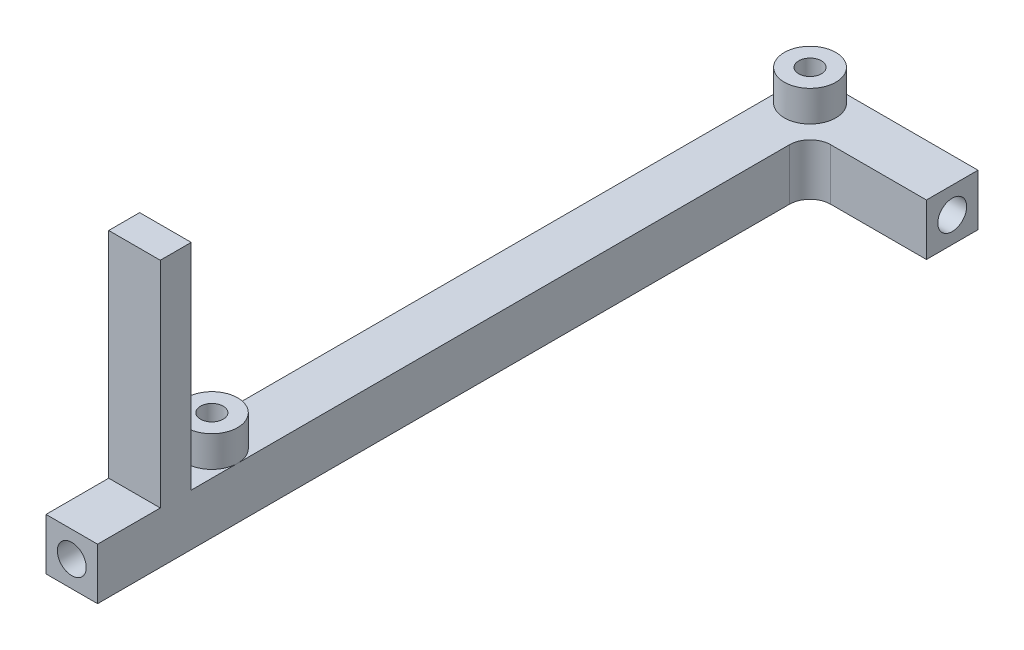
ISO-10303-21;
HEADER;
FILE_DESCRIPTION(('STEP AP214'),'2;1');
FILE_NAME('part.step','',(''),(''),'','','');
FILE_SCHEMA(('AUTOMOTIVE_DESIGN { 1 0 10303 214 1 1 1 1 }'));
ENDSEC;
DATA;
#1=APPLICATION_CONTEXT('core data for automotive mechanical design processes');
#2=APPLICATION_PROTOCOL_DEFINITION('international standard','automotive_design',2000,#1);
#3=PRODUCT_CONTEXT('',#1,'mechanical');
#4=PRODUCT('Part','Part','',(#3));
#5=PRODUCT_RELATED_PRODUCT_CATEGORY('part','',(#4));
#6=PRODUCT_DEFINITION_FORMATION('','',#4);
#7=PRODUCT_DEFINITION_CONTEXT('part definition',#1,'design');
#8=PRODUCT_DEFINITION('design','',#6,#7);
#9=PRODUCT_DEFINITION_SHAPE('','',#8);
#10=(LENGTH_UNIT() NAMED_UNIT(*) SI_UNIT(.MILLI.,.METRE.));
#11=(NAMED_UNIT(*) PLANE_ANGLE_UNIT() SI_UNIT($,.RADIAN.));
#12=(NAMED_UNIT(*) SI_UNIT($,.STERADIAN.) SOLID_ANGLE_UNIT());
#13=UNCERTAINTY_MEASURE_WITH_UNIT(LENGTH_MEASURE(1.E-05),#10,'distance_accuracy_value','');
#14=(GEOMETRIC_REPRESENTATION_CONTEXT(3) GLOBAL_UNCERTAINTY_ASSIGNED_CONTEXT((#13)) GLOBAL_UNIT_ASSIGNED_CONTEXT((#10,
#11,#12)) REPRESENTATION_CONTEXT('',''));
#15=CARTESIAN_POINT('',(0.,0.,0.));
#16=DIRECTION('',(0.,0.,1.));
#17=DIRECTION('',(1.,0.,0.));
#18=AXIS2_PLACEMENT_3D('',#15,#16,#17);
#19=CARTESIAN_POINT('',(-2.5,2.5,74.08));
#20=DIRECTION('',(0.,-1.,0.));
#21=DIRECTION('',(0.,0.,-1.));
#22=AXIS2_PLACEMENT_3D('',#19,#20,#21);
#23=PLANE('',#22);
#24=DIRECTION('',(1.,0.,0.));
#25=VECTOR('',#24,1.);
#26=CARTESIAN_POINT('',(-2.5,2.5,68.));
#27=LINE('',#26,#25);
#28=CARTESIAN_POINT('',(-2.5,2.5,68.));
#29=VERTEX_POINT('',#28);
#30=CARTESIAN_POINT('',(2.5,2.5,68.));
#31=VERTEX_POINT('',#30);
#32=EDGE_CURVE('E367',#29,#31,#27,.T.);
#33=ORIENTED_EDGE('',*,*,#32,.F.);
#34=DIRECTION('',(0.,0.,-1.));
#35=VECTOR('',#34,1.);
#36=CARTESIAN_POINT('',(-2.5,2.5,74.08));
#37=LINE('',#36,#35);
#38=CARTESIAN_POINT('',(-2.5,2.5,74.08));
#39=VERTEX_POINT('',#38);
#40=EDGE_CURVE('E167',#39,#29,#37,.T.);
#41=ORIENTED_EDGE('',*,*,#40,.F.);
#42=DIRECTION('',(-1.,0.,0.));
#43=VECTOR('',#42,1.);
#44=CARTESIAN_POINT('',(-2.5,2.5,74.08));
#45=LINE('',#44,#43);
#46=CARTESIAN_POINT('',(2.5,2.5,74.08));
#47=VERTEX_POINT('',#46);
#48=EDGE_CURVE('E252',#47,#39,#45,.T.);
#49=ORIENTED_EDGE('',*,*,#48,.F.);
#50=DIRECTION('',(0.,0.,-1.));
#51=VECTOR('',#50,1.);
#52=CARTESIAN_POINT('',(2.5,2.5,74.08));
#53=LINE('',#52,#51);
#54=EDGE_CURVE('E280',#47,#31,#53,.T.);
#55=ORIENTED_EDGE('',*,*,#54,.T.);
#56=EDGE_LOOP('',(#33,#41,#49,#55));
#57=FACE_BOUND('',#56,.T.);
#58=ADVANCED_FACE('F39',(#57),#23,.F.);
#59=DIRECTION('',(-1.,0.,0.));
#60=VECTOR('',#59,1.);
#61=CARTESIAN_POINT('',(-2.5,2.5,65.));
#62=LINE('',#61,#60);
#63=CARTESIAN_POINT('',(2.5,2.5,65.));
#64=VERTEX_POINT('',#63);
#65=CARTESIAN_POINT('',(-2.5,2.5,65.));
#66=VERTEX_POINT('',#65);
#67=EDGE_CURVE('E160',#64,#66,#62,.T.);
#68=ORIENTED_EDGE('',*,*,#67,.F.);
#69=CARTESIAN_POINT('',(2.5,2.5,60.5));
#70=VERTEX_POINT('',#69);
#71=EDGE_CURVE('E284',#64,#70,#53,.T.);
#72=ORIENTED_EDGE('',*,*,#71,.T.);
#73=CARTESIAN_POINT('',(0.,2.5,60.5));
#74=DIRECTION('',(0.,1.,0.));
#75=DIRECTION('',(0.,0.,1.));
#76=AXIS2_PLACEMENT_3D('',#73,#74,#75);
#77=CIRCLE('',#76,2.49999999999999);
#78=CARTESIAN_POINT('',(-2.5,2.5,60.5));
#79=VERTEX_POINT('',#78);
#80=EDGE_CURVE('E209',#79,#70,#77,.T.);
#81=ORIENTED_EDGE('',*,*,#80,.F.);
#82=EDGE_CURVE('E278',#66,#79,#37,.T.);
#83=ORIENTED_EDGE('',*,*,#82,.F.);
#84=EDGE_LOOP('',(#68,#72,#81,#83));
#85=FACE_BOUND('',#84,.T.);
#86=ADVANCED_FACE('F358',(#85),#23,.F.);
#87=DIRECTION('',(-1.,0.,0.));
#88=VECTOR('',#87,1.);
#89=CARTESIAN_POINT('',(-2.5,2.5,0.));
#90=LINE('',#89,#88);
#91=CARTESIAN_POINT('',(0.,2.5,0.));
#92=VERTEX_POINT('',#91);
#93=CARTESIAN_POINT('',(-0.500000000000001,2.5,0.));
#94=VERTEX_POINT('',#93);
#95=EDGE_CURVE('E244',#92,#94,#90,.T.);
#96=ORIENTED_EDGE('',*,*,#95,.T.);
#97=CARTESIAN_POINT('',(-0.500000000000001,2.5,2.));
#98=DIRECTION('',(0.,-1.,0.));
#99=DIRECTION('',(0.,0.,-1.));
#100=AXIS2_PLACEMENT_3D('',#97,#98,#99);
#101=CIRCLE('',#100,2.);
#102=CARTESIAN_POINT('',(-2.5,2.5,2.00000000000003));
#103=VERTEX_POINT('',#102);
#104=EDGE_CURVE('E295',#94,#103,#101,.F.);
#105=ORIENTED_EDGE('',*,*,#104,.T.);
#106=CARTESIAN_POINT('',(-2.5,2.5,2.50000000000004));
#107=VERTEX_POINT('',#106);
#108=EDGE_CURVE('E274',#107,#103,#37,.T.);
#109=ORIENTED_EDGE('',*,*,#108,.F.);
#110=CARTESIAN_POINT('',(0.,2.5,2.50000000000002));
#111=DIRECTION('',(0.,1.,0.));
#112=DIRECTION('',(0.,0.,1.));
#113=AXIS2_PLACEMENT_3D('',#110,#111,#112);
#114=CIRCLE('',#113,2.5);
#115=EDGE_CURVE('E189',#92,#107,#114,.T.);
#116=ORIENTED_EDGE('',*,*,#115,.F.);
#117=EDGE_LOOP('',(#96,#105,#109,#116));
#118=FACE_BOUND('',#117,.T.);
#119=ADVANCED_FACE('F340',(#118),#23,.F.);
#120=EDGE_CURVE('E182',#107,#92,#114,.T.);
#121=ORIENTED_EDGE('',*,*,#120,.F.);
#122=EDGE_CURVE('E279',#79,#107,#37,.T.);
#123=ORIENTED_EDGE('',*,*,#122,.F.);
#124=EDGE_CURVE('E197',#70,#79,#77,.T.);
#125=ORIENTED_EDGE('',*,*,#124,.F.);
#126=CARTESIAN_POINT('',(2.5,2.5,7.00000000000003));
#127=VERTEX_POINT('',#126);
#128=EDGE_CURVE('E277',#70,#127,#53,.T.);
#129=ORIENTED_EDGE('',*,*,#128,.T.);
#130=CARTESIAN_POINT('',(4.5,2.5,7.));
#131=DIRECTION('',(0.,-1.,0.));
#132=DIRECTION('',(0.,0.,-1.));
#133=AXIS2_PLACEMENT_3D('',#130,#131,#132);
#134=CIRCLE('',#133,2.);
#135=CARTESIAN_POINT('',(4.5,2.5,5.));
#136=VERTEX_POINT('',#135);
#137=EDGE_CURVE('E11',#127,#136,#134,.T.);
#138=ORIENTED_EDGE('',*,*,#137,.T.);
#139=DIRECTION('',(-1.,0.,0.));
#140=VECTOR('',#139,1.);
#141=CARTESIAN_POINT('',(13.78,2.5,5.));
#142=LINE('',#141,#140);
#143=CARTESIAN_POINT('',(13.78,2.5,5.));
#144=VERTEX_POINT('',#143);
#145=EDGE_CURVE('E235',#144,#136,#142,.T.);
#146=ORIENTED_EDGE('',*,*,#145,.F.);
#147=DIRECTION('',(0.,0.,1.));
#148=VECTOR('',#147,1.);
#149=CARTESIAN_POINT('',(13.78,2.5,0.));
#150=LINE('',#149,#148);
#151=CARTESIAN_POINT('',(13.78,2.5,0.));
#152=VERTEX_POINT('',#151);
#153=EDGE_CURVE('E221',#152,#144,#150,.T.);
#154=ORIENTED_EDGE('',*,*,#153,.F.);
#155=EDGE_CURVE('E263',#152,#92,#90,.T.);
#156=ORIENTED_EDGE('',*,*,#155,.T.);
#157=EDGE_LOOP('',(#121,#123,#125,#129,#138,#146,#154,#156));
#158=FACE_BOUND('',#157,.T.);
#159=ADVANCED_FACE('F318',(#158),#23,.F.);
#160=CARTESIAN_POINT('',(2.5,2.5,74.08));
#161=DIRECTION('',(-1.,0.,0.));
#162=DIRECTION('',(0.,-1.,0.));
#163=AXIS2_PLACEMENT_3D('',#160,#161,#162);
#164=PLANE('',#163);
#165=DIRECTION('',(0.,0.,-1.));
#166=VECTOR('',#165,1.);
#167=CARTESIAN_POINT('',(2.5,-2.5,74.08));
#168=LINE('',#167,#166);
#169=CARTESIAN_POINT('',(2.5,-2.5,74.08));
#170=VERTEX_POINT('',#169);
#171=CARTESIAN_POINT('',(2.5,-2.5,7.00000000000003));
#172=VERTEX_POINT('',#171);
#173=EDGE_CURVE('E262',#170,#172,#168,.T.);
#174=ORIENTED_EDGE('',*,*,#173,.T.);
#175=DIRECTION('',(0.,-1.,0.));
#176=VECTOR('',#175,1.);
#177=CARTESIAN_POINT('',(2.5,2.5,7.));
#178=LINE('',#177,#176);
#179=EDGE_CURVE('E63',#172,#127,#178,.F.);
#180=ORIENTED_EDGE('',*,*,#179,.T.);
#181=ORIENTED_EDGE('',*,*,#128,.F.);
#182=ORIENTED_EDGE('',*,*,#71,.F.);
#183=DIRECTION('',(0.,-1.,0.));
#184=VECTOR('',#183,1.);
#185=CARTESIAN_POINT('',(2.5,23.3,65.));
#186=LINE('',#185,#184);
#187=CARTESIAN_POINT('',(2.5,23.3,65.));
#188=VERTEX_POINT('',#187);
#189=EDGE_CURVE('E176',#188,#64,#186,.T.);
#190=ORIENTED_EDGE('',*,*,#189,.F.);
#191=DIRECTION('',(0.,0.,-1.));
#192=VECTOR('',#191,1.);
#193=CARTESIAN_POINT('',(2.5,23.3,65.));
#194=LINE('',#193,#192);
#195=CARTESIAN_POINT('',(2.5,23.3,68.));
#196=VERTEX_POINT('',#195);
#197=EDGE_CURVE('E153',#196,#188,#194,.T.);
#198=ORIENTED_EDGE('',*,*,#197,.F.);
#199=DIRECTION('',(0.,-1.,0.));
#200=VECTOR('',#199,1.);
#201=CARTESIAN_POINT('',(2.5,23.3,68.));
#202=LINE('',#201,#200);
#203=EDGE_CURVE('E149',#196,#31,#202,.T.);
#204=ORIENTED_EDGE('',*,*,#203,.T.);
#205=ORIENTED_EDGE('',*,*,#54,.F.);
#206=DIRECTION('',(0.,1.,0.));
#207=VECTOR('',#206,1.);
#208=CARTESIAN_POINT('',(2.5,2.5,74.08));
#209=LINE('',#208,#207);
#210=EDGE_CURVE('E248',#170,#47,#209,.T.);
#211=ORIENTED_EDGE('',*,*,#210,.F.);
#212=EDGE_LOOP('',(#174,#180,#181,#182,#190,#198,#204,#205,#211));
#213=FACE_BOUND('',#212,.T.);
#214=ADVANCED_FACE('F313',(#213),#164,.F.);
#215=CARTESIAN_POINT('',(-2.5,2.5,74.08));
#216=DIRECTION('',(1.,0.,0.));
#217=DIRECTION('',(0.,1.,0.));
#218=AXIS2_PLACEMENT_3D('',#215,#216,#217);
#219=PLANE('',#218);
#220=ORIENTED_EDGE('',*,*,#108,.T.);
#221=DIRECTION('',(0.,-1.,0.));
#222=VECTOR('',#221,1.);
#223=CARTESIAN_POINT('',(-2.5,2.5,2.));
#224=LINE('',#223,#222);
#225=CARTESIAN_POINT('',(-2.5,-2.5,2.00000000000003));
#226=VERTEX_POINT('',#225);
#227=EDGE_CURVE('E285',#103,#226,#224,.T.);
#228=ORIENTED_EDGE('',*,*,#227,.T.);
#229=DIRECTION('',(0.,0.,-1.));
#230=VECTOR('',#229,1.);
#231=CARTESIAN_POINT('',(-2.5,-2.5,74.08));
#232=LINE('',#231,#230);
#233=CARTESIAN_POINT('',(-2.5,-2.5,74.08));
#234=VERTEX_POINT('',#233);
#235=EDGE_CURVE('E270',#234,#226,#232,.T.);
#236=ORIENTED_EDGE('',*,*,#235,.F.);
#237=DIRECTION('',(0.,-1.,0.));
#238=VECTOR('',#237,1.);
#239=CARTESIAN_POINT('',(-2.5,2.5,74.08));
#240=LINE('',#239,#238);
#241=EDGE_CURVE('E256',#39,#234,#240,.T.);
#242=ORIENTED_EDGE('',*,*,#241,.F.);
#243=ORIENTED_EDGE('',*,*,#40,.T.);
#244=DIRECTION('',(0.,-1.,0.));
#245=VECTOR('',#244,1.);
#246=CARTESIAN_POINT('',(-2.5,23.3,68.));
#247=LINE('',#246,#245);
#248=CARTESIAN_POINT('',(-2.5,23.3,68.));
#249=VERTEX_POINT('',#248);
#250=EDGE_CURVE('E146',#249,#29,#247,.T.);
#251=ORIENTED_EDGE('',*,*,#250,.F.);
#252=DIRECTION('',(0.,0.,1.));
#253=VECTOR('',#252,1.);
#254=CARTESIAN_POINT('',(-2.5,23.3,65.));
#255=LINE('',#254,#253);
#256=CARTESIAN_POINT('',(-2.5,23.3,65.));
#257=VERTEX_POINT('',#256);
#258=EDGE_CURVE('E154',#257,#249,#255,.T.);
#259=ORIENTED_EDGE('',*,*,#258,.F.);
#260=DIRECTION('',(0.,-1.,0.));
#261=VECTOR('',#260,1.);
#262=CARTESIAN_POINT('',(-2.5,23.3,65.));
#263=LINE('',#262,#261);
#264=EDGE_CURVE('E55',#257,#66,#263,.T.);
#265=ORIENTED_EDGE('',*,*,#264,.T.);
#266=ORIENTED_EDGE('',*,*,#82,.T.);
#267=ORIENTED_EDGE('',*,*,#122,.T.);
#268=EDGE_LOOP('',(#220,#228,#236,#242,#243,#251,#259,#265,#266,#267));
#269=FACE_BOUND('',#268,.T.);
#270=ADVANCED_FACE('F164',(#269),#219,.F.);
#271=CARTESIAN_POINT('',(-2.5,-2.5,74.08));
#272=DIRECTION('',(0.,1.,0.));
#273=DIRECTION('',(0.,0.,1.));
#274=AXIS2_PLACEMENT_3D('',#271,#272,#273);
#275=PLANE('',#274);
#276=ORIENTED_EDGE('',*,*,#235,.T.);
#277=CARTESIAN_POINT('',(-0.5,-2.5,2.));
#278=DIRECTION('',(0.,1.,0.));
#279=DIRECTION('',(0.,0.,1.));
#280=AXIS2_PLACEMENT_3D('',#277,#278,#279);
#281=CIRCLE('',#280,2.);
#282=CARTESIAN_POINT('',(-0.5,-2.5,0.));
#283=VERTEX_POINT('',#282);
#284=EDGE_CURVE('E289',#226,#283,#281,.F.);
#285=ORIENTED_EDGE('',*,*,#284,.T.);
#286=DIRECTION('',(1.,0.,0.));
#287=VECTOR('',#286,1.);
#288=CARTESIAN_POINT('',(-2.5,-2.5,0.));
#289=LINE('',#288,#287);
#290=CARTESIAN_POINT('',(13.78,-2.5,0.));
#291=VERTEX_POINT('',#290);
#292=EDGE_CURVE('E253',#283,#291,#289,.T.);
#293=ORIENTED_EDGE('',*,*,#292,.T.);
#294=DIRECTION('',(0.,0.,-1.));
#295=VECTOR('',#294,1.);
#296=CARTESIAN_POINT('',(13.78,-2.5,0.));
#297=LINE('',#296,#295);
#298=CARTESIAN_POINT('',(13.78,-2.5,5.));
#299=VERTEX_POINT('',#298);
#300=EDGE_CURVE('E227',#299,#291,#297,.T.);
#301=ORIENTED_EDGE('',*,*,#300,.F.);
#302=DIRECTION('',(-1.,0.,0.));
#303=VECTOR('',#302,1.);
#304=CARTESIAN_POINT('',(13.78,-2.5,5.));
#305=LINE('',#304,#303);
#306=CARTESIAN_POINT('',(4.5,-2.5,5.));
#307=VERTEX_POINT('',#306);
#308=EDGE_CURVE('E231',#299,#307,#305,.T.);
#309=ORIENTED_EDGE('',*,*,#308,.T.);
#310=CARTESIAN_POINT('',(4.5,-2.5,7.));
#311=DIRECTION('',(0.,1.,0.));
#312=DIRECTION('',(0.,0.,1.));
#313=AXIS2_PLACEMENT_3D('',#310,#311,#312);
#314=CIRCLE('',#313,2.);
#315=EDGE_CURVE('E48',#307,#172,#314,.T.);
#316=ORIENTED_EDGE('',*,*,#315,.T.);
#317=ORIENTED_EDGE('',*,*,#173,.F.);
#318=DIRECTION('',(1.,0.,0.));
#319=VECTOR('',#318,1.);
#320=CARTESIAN_POINT('',(-2.5,-2.5,74.08));
#321=LINE('',#320,#319);
#322=EDGE_CURVE('E259',#234,#170,#321,.T.);
#323=ORIENTED_EDGE('',*,*,#322,.F.);
#324=EDGE_LOOP('',(#276,#285,#293,#301,#309,#316,#317,#323));
#325=FACE_BOUND('',#324,.T.);
#326=ADVANCED_FACE('F306',(#325),#275,.F.);
#327=CARTESIAN_POINT('',(0.,0.,74.08));
#328=DIRECTION('',(0.,0.,1.));
#329=DIRECTION('',(1.,0.,0.));
#330=AXIS2_PLACEMENT_3D('',#327,#328,#329);
#331=PLANE('',#330);
#332=CARTESIAN_POINT('',(0.,0.,74.08));
#333=DIRECTION('',(0.,0.,1.));
#334=DIRECTION('',(1.,0.,0.));
#335=AXIS2_PLACEMENT_3D('',#332,#333,#334);
#336=CIRCLE('',#335,1.4);
#337=CARTESIAN_POINT('',(1.4,0.,74.08));
#338=VERTEX_POINT('',#337);
#339=EDGE_CURVE('E239',#338,#338,#336,.T.);
#340=ORIENTED_EDGE('',*,*,#339,.F.);
#341=EDGE_LOOP('',(#340));
#342=FACE_BOUND('',#341,.T.);
#343=ORIENTED_EDGE('',*,*,#210,.T.);
#344=ORIENTED_EDGE('',*,*,#48,.T.);
#345=ORIENTED_EDGE('',*,*,#241,.T.);
#346=ORIENTED_EDGE('',*,*,#322,.T.);
#347=EDGE_LOOP('',(#343,#344,#345,#346));
#348=FACE_BOUND('',#347,.T.);
#349=ADVANCED_FACE('F365',(#342,#348),#331,.T.);
#350=CARTESIAN_POINT('',(0.,0.,0.));
#351=DIRECTION('',(0.,0.,1.));
#352=DIRECTION('',(1.,0.,0.));
#353=AXIS2_PLACEMENT_3D('',#350,#351,#352);
#354=PLANE('',#353);
#355=ORIENTED_EDGE('',*,*,#292,.F.);
#356=DIRECTION('',(0.,-1.,0.));
#357=VECTOR('',#356,1.);
#358=CARTESIAN_POINT('',(-0.5,0.,0.));
#359=LINE('',#358,#357);
#360=EDGE_CURVE('E292',#283,#94,#359,.F.);
#361=ORIENTED_EDGE('',*,*,#360,.T.);
#362=ORIENTED_EDGE('',*,*,#95,.F.);
#363=ORIENTED_EDGE('',*,*,#155,.F.);
#364=DIRECTION('',(0.,1.,0.));
#365=VECTOR('',#364,1.);
#366=CARTESIAN_POINT('',(13.78,2.5,0.));
#367=LINE('',#366,#365);
#368=EDGE_CURVE('E214',#291,#152,#367,.T.);
#369=ORIENTED_EDGE('',*,*,#368,.F.);
#370=EDGE_LOOP('',(#355,#361,#362,#363,#369));
#371=FACE_BOUND('',#370,.T.);
#372=ADVANCED_FACE('F335',(#371),#354,.F.);
#373=CARTESIAN_POINT('',(0.,0.,64.08));
#374=DIRECTION('',(0.,0.,1.));
#375=DIRECTION('',(1.,0.,0.));
#376=AXIS2_PLACEMENT_3D('',#373,#374,#375);
#377=CYLINDRICAL_SURFACE('',#376,1.4);
#378=CARTESIAN_POINT('',(0.,0.,64.08));
#379=DIRECTION('',(0.,0.,1.));
#380=DIRECTION('',(1.,0.,0.));
#381=AXIS2_PLACEMENT_3D('',#378,#379,#380);
#382=CIRCLE('',#381,1.4);
#383=CARTESIAN_POINT('',(1.4,0.,64.08));
#384=VERTEX_POINT('',#383);
#385=EDGE_CURVE('E240',#384,#384,#382,.T.);
#386=ORIENTED_EDGE('',*,*,#385,.F.);
#387=EDGE_LOOP('',(#386));
#388=FACE_BOUND('',#387,.T.);
#389=ORIENTED_EDGE('',*,*,#339,.T.);
#390=EDGE_LOOP('',(#389));
#391=FACE_BOUND('',#390,.T.);
#392=ADVANCED_FACE('F458',(#388,#391),#377,.F.);
#393=CARTESIAN_POINT('',(0.,0.,64.08));
#394=DIRECTION('',(0.,0.,1.));
#395=DIRECTION('',(1.,0.,0.));
#396=AXIS2_PLACEMENT_3D('',#393,#394,#395);
#397=PLANE('',#396);
#398=ORIENTED_EDGE('',*,*,#385,.T.);
#399=EDGE_LOOP('',(#398));
#400=FACE_BOUND('',#399,.T.);
#401=ADVANCED_FACE('F455',(#400),#397,.T.);
#402=CARTESIAN_POINT('',(13.78,2.5,5.));
#403=DIRECTION('',(0.,0.,-1.));
#404=DIRECTION('',(-1.,0.,0.));
#405=AXIS2_PLACEMENT_3D('',#402,#403,#404);
#406=PLANE('',#405);
#407=ORIENTED_EDGE('',*,*,#145,.T.);
#408=DIRECTION('',(0.,-1.,0.));
#409=VECTOR('',#408,1.);
#410=CARTESIAN_POINT('',(4.5,-2.5,5.));
#411=LINE('',#410,#409);
#412=EDGE_CURVE('E298',#136,#307,#411,.T.);
#413=ORIENTED_EDGE('',*,*,#412,.T.);
#414=ORIENTED_EDGE('',*,*,#308,.F.);
#415=DIRECTION('',(0.,-1.,0.));
#416=VECTOR('',#415,1.);
#417=CARTESIAN_POINT('',(13.78,2.5,5.));
#418=LINE('',#417,#416);
#419=EDGE_CURVE('E224',#144,#299,#418,.T.);
#420=ORIENTED_EDGE('',*,*,#419,.F.);
#421=EDGE_LOOP('',(#407,#413,#414,#420));
#422=FACE_BOUND('',#421,.T.);
#423=ADVANCED_FACE('F323',(#422),#406,.F.);
#424=CARTESIAN_POINT('',(13.78,0.,0.));
#425=DIRECTION('',(-1.,0.,0.));
#426=DIRECTION('',(0.,-1.,0.));
#427=AXIS2_PLACEMENT_3D('',#424,#425,#426);
#428=PLANE('',#427);
#429=CARTESIAN_POINT('',(13.78,0.,2.5));
#430=DIRECTION('',(1.,0.,0.));
#431=DIRECTION('',(0.,1.,0.));
#432=AXIS2_PLACEMENT_3D('',#429,#430,#431);
#433=CIRCLE('',#432,1.4);
#434=CARTESIAN_POINT('',(13.78,1.4,2.5));
#435=VERTEX_POINT('',#434);
#436=EDGE_CURVE('E205',#435,#435,#433,.T.);
#437=ORIENTED_EDGE('',*,*,#436,.F.);
#438=EDGE_LOOP('',(#437));
#439=FACE_BOUND('',#438,.T.);
#440=ORIENTED_EDGE('',*,*,#368,.T.);
#441=ORIENTED_EDGE('',*,*,#153,.T.);
#442=ORIENTED_EDGE('',*,*,#419,.T.);
#443=ORIENTED_EDGE('',*,*,#300,.T.);
#444=EDGE_LOOP('',(#440,#441,#442,#443));
#445=FACE_BOUND('',#444,.T.);
#446=ADVANCED_FACE('F325',(#439,#445),#428,.F.);
#447=CARTESIAN_POINT('',(3.78,0.,2.5));
#448=DIRECTION('',(1.,0.,0.));
#449=DIRECTION('',(0.,1.,0.));
#450=AXIS2_PLACEMENT_3D('',#447,#448,#449);
#451=CYLINDRICAL_SURFACE('',#450,1.4);
#452=CARTESIAN_POINT('',(3.78,0.,2.5));
#453=DIRECTION('',(1.,0.,0.));
#454=DIRECTION('',(0.,1.,0.));
#455=AXIS2_PLACEMENT_3D('',#452,#453,#454);
#456=CIRCLE('',#455,1.4);
#457=CARTESIAN_POINT('',(3.78,1.4,2.5));
#458=VERTEX_POINT('',#457);
#459=EDGE_CURVE('E210',#458,#458,#456,.T.);
#460=ORIENTED_EDGE('',*,*,#459,.F.);
#461=EDGE_LOOP('',(#460));
#462=FACE_BOUND('',#461,.T.);
#463=ORIENTED_EDGE('',*,*,#436,.T.);
#464=EDGE_LOOP('',(#463));
#465=FACE_BOUND('',#464,.T.);
#466=ADVANCED_FACE('F445',(#462,#465),#451,.F.);
#467=CARTESIAN_POINT('',(3.78,0.,2.5));
#468=DIRECTION('',(1.,0.,0.));
#469=DIRECTION('',(0.,1.,0.));
#470=AXIS2_PLACEMENT_3D('',#467,#468,#469);
#471=PLANE('',#470);
#472=ORIENTED_EDGE('',*,*,#459,.T.);
#473=EDGE_LOOP('',(#472));
#474=FACE_BOUND('',#473,.T.);
#475=ADVANCED_FACE('F438',(#474),#471,.T.);
#476=CARTESIAN_POINT('',(0.,5.5,60.5));
#477=DIRECTION('',(0.,1.,0.));
#478=DIRECTION('',(0.,0.,1.));
#479=AXIS2_PLACEMENT_3D('',#476,#477,#478);
#480=PLANE('',#479);
#481=CARTESIAN_POINT('',(0.,5.5,60.5));
#482=DIRECTION('',(0.,1.,0.));
#483=DIRECTION('',(0.,0.,1.));
#484=AXIS2_PLACEMENT_3D('',#481,#482,#483);
#485=CIRCLE('',#484,2.49999999999999);
#486=CARTESIAN_POINT('',(0.,5.5,63.));
#487=VERTEX_POINT('',#486);
#488=EDGE_CURVE('E201',#487,#487,#485,.T.);
#489=ORIENTED_EDGE('',*,*,#488,.T.);
#490=EDGE_LOOP('',(#489));
#491=FACE_BOUND('',#490,.T.);
#492=CARTESIAN_POINT('',(0.,5.5,60.5));
#493=DIRECTION('',(0.,1.,0.));
#494=DIRECTION('',(0.,0.,1.));
#495=AXIS2_PLACEMENT_3D('',#492,#493,#494);
#496=CIRCLE('',#495,1.1);
#497=CARTESIAN_POINT('',(0.,5.5,61.6));
#498=VERTEX_POINT('',#497);
#499=EDGE_CURVE('E193',#498,#498,#496,.T.);
#500=ORIENTED_EDGE('',*,*,#499,.F.);
#501=EDGE_LOOP('',(#500));
#502=FACE_BOUND('',#501,.T.);
#503=ADVANCED_FACE('F435',(#491,#502),#480,.T.);
#504=CARTESIAN_POINT('',(0.,5.5,60.5));
#505=DIRECTION('',(0.,-1.,0.));
#506=DIRECTION('',(0.,0.,-1.));
#507=AXIS2_PLACEMENT_3D('',#504,#505,#506);
#508=CYLINDRICAL_SURFACE('',#507,2.49999999999999);
#509=ORIENTED_EDGE('',*,*,#488,.F.);
#510=EDGE_LOOP('',(#509));
#511=FACE_BOUND('',#510,.T.);
#512=ORIENTED_EDGE('',*,*,#124,.T.);
#513=ORIENTED_EDGE('',*,*,#80,.T.);
#514=EDGE_LOOP('',(#512,#513));
#515=FACE_BOUND('',#514,.T.);
#516=ADVANCED_FACE('F354',(#511,#515),#508,.T.);
#517=CARTESIAN_POINT('',(0.,5.5,60.5));
#518=DIRECTION('',(0.,-1.,0.));
#519=DIRECTION('',(0.,0.,-1.));
#520=AXIS2_PLACEMENT_3D('',#517,#518,#519);
#521=CYLINDRICAL_SURFACE('',#520,1.1);
#522=ORIENTED_EDGE('',*,*,#499,.T.);
#523=EDGE_LOOP('',(#522));
#524=FACE_BOUND('',#523,.T.);
#525=CARTESIAN_POINT('',(0.,2.5,60.5));
#526=DIRECTION('',(0.,1.,0.));
#527=DIRECTION('',(0.,0.,1.));
#528=AXIS2_PLACEMENT_3D('',#525,#526,#527);
#529=CIRCLE('',#528,1.1);
#530=CARTESIAN_POINT('',(0.,2.5,61.6));
#531=VERTEX_POINT('',#530);
#532=EDGE_CURVE('E188',#531,#531,#529,.T.);
#533=ORIENTED_EDGE('',*,*,#532,.F.);
#534=EDGE_LOOP('',(#533));
#535=FACE_BOUND('',#534,.T.);
#536=ADVANCED_FACE('F401',(#524,#535),#521,.F.);
#537=ORIENTED_EDGE('',*,*,#532,.T.);
#538=EDGE_LOOP('',(#537));
#539=FACE_BOUND('',#538,.T.);
#540=ADVANCED_FACE('F392',(#539),#23,.F.);
#541=CARTESIAN_POINT('',(0.,5.5,2.50000000000002));
#542=DIRECTION('',(0.,1.,0.));
#543=DIRECTION('',(0.,0.,1.));
#544=AXIS2_PLACEMENT_3D('',#541,#542,#543);
#545=PLANE('',#544);
#546=CARTESIAN_POINT('',(0.,5.5,2.50000000000002));
#547=DIRECTION('',(0.,1.,0.));
#548=DIRECTION('',(0.,0.,1.));
#549=AXIS2_PLACEMENT_3D('',#546,#547,#548);
#550=CIRCLE('',#549,2.5);
#551=CARTESIAN_POINT('',(0.,5.5,5.00000000000002));
#552=VERTEX_POINT('',#551);
#553=EDGE_CURVE('E184',#552,#552,#550,.T.);
#554=ORIENTED_EDGE('',*,*,#553,.T.);
#555=EDGE_LOOP('',(#554));
#556=FACE_BOUND('',#555,.T.);
#557=CARTESIAN_POINT('',(0.,5.5,2.50000000000002));
#558=DIRECTION('',(0.,1.,0.));
#559=DIRECTION('',(0.,0.,1.));
#560=AXIS2_PLACEMENT_3D('',#557,#558,#559);
#561=CIRCLE('',#560,1.1);
#562=CARTESIAN_POINT('',(0.,5.5,3.60000000000002));
#563=VERTEX_POINT('',#562);
#564=EDGE_CURVE('E174',#563,#563,#561,.T.);
#565=ORIENTED_EDGE('',*,*,#564,.F.);
#566=EDGE_LOOP('',(#565));
#567=FACE_BOUND('',#566,.T.);
#568=ADVANCED_FACE('F400',(#556,#567),#545,.T.);
#569=CARTESIAN_POINT('',(0.,5.5,2.50000000000002));
#570=DIRECTION('',(0.,-1.,0.));
#571=DIRECTION('',(0.,0.,-1.));
#572=AXIS2_PLACEMENT_3D('',#569,#570,#571);
#573=CYLINDRICAL_SURFACE('',#572,2.5);
#574=ORIENTED_EDGE('',*,*,#553,.F.);
#575=EDGE_LOOP('',(#574));
#576=FACE_BOUND('',#575,.T.);
#577=ORIENTED_EDGE('',*,*,#115,.T.);
#578=ORIENTED_EDGE('',*,*,#120,.T.);
#579=EDGE_LOOP('',(#577,#578));
#580=FACE_BOUND('',#579,.T.);
#581=ADVANCED_FACE('F343',(#576,#580),#573,.T.);
#582=CARTESIAN_POINT('',(0.,5.5,2.50000000000002));
#583=DIRECTION('',(0.,-1.,0.));
#584=DIRECTION('',(0.,0.,-1.));
#585=AXIS2_PLACEMENT_3D('',#582,#583,#584);
#586=CYLINDRICAL_SURFACE('',#585,1.1);
#587=ORIENTED_EDGE('',*,*,#564,.T.);
#588=EDGE_LOOP('',(#587));
#589=FACE_BOUND('',#588,.T.);
#590=CARTESIAN_POINT('',(0.,2.5,2.50000000000002));
#591=DIRECTION('',(0.,1.,0.));
#592=DIRECTION('',(0.,0.,1.));
#593=AXIS2_PLACEMENT_3D('',#590,#591,#592);
#594=CIRCLE('',#593,1.1);
#595=CARTESIAN_POINT('',(0.,2.5,3.60000000000002));
#596=VERTEX_POINT('',#595);
#597=EDGE_CURVE('E169',#596,#596,#594,.T.);
#598=ORIENTED_EDGE('',*,*,#597,.F.);
#599=EDGE_LOOP('',(#598));
#600=FACE_BOUND('',#599,.T.);
#601=ADVANCED_FACE('F419',(#589,#600),#586,.F.);
#602=ORIENTED_EDGE('',*,*,#597,.T.);
#603=EDGE_LOOP('',(#602));
#604=FACE_BOUND('',#603,.T.);
#605=ADVANCED_FACE('F412',(#604),#23,.F.);
#606=CARTESIAN_POINT('',(-0.500000000000001,2.5,2.));
#607=DIRECTION('',(0.,-1.,0.));
#608=DIRECTION('',(1.,0.,0.));
#609=AXIS2_PLACEMENT_3D('',#606,#607,#608);
#610=CYLINDRICAL_SURFACE('',#609,2.);
#611=ORIENTED_EDGE('',*,*,#104,.F.);
#612=ORIENTED_EDGE('',*,*,#360,.F.);
#613=ORIENTED_EDGE('',*,*,#284,.F.);
#614=ORIENTED_EDGE('',*,*,#227,.F.);
#615=EDGE_LOOP('',(#611,#612,#613,#614));
#616=FACE_BOUND('',#615,.T.);
#617=ADVANCED_FACE('F363',(#616),#610,.T.);
#618=CARTESIAN_POINT('',(4.5,2.5,7.));
#619=DIRECTION('',(0.,1.,0.));
#620=DIRECTION('',(-1.,0.,0.));
#621=AXIS2_PLACEMENT_3D('',#618,#619,#620);
#622=CYLINDRICAL_SURFACE('',#621,2.);
#623=ORIENTED_EDGE('',*,*,#137,.F.);
#624=ORIENTED_EDGE('',*,*,#179,.F.);
#625=ORIENTED_EDGE('',*,*,#315,.F.);
#626=ORIENTED_EDGE('',*,*,#412,.F.);
#627=EDGE_LOOP('',(#623,#624,#625,#626));
#628=FACE_BOUND('',#627,.T.);
#629=ADVANCED_FACE('F41',(#628),#622,.F.);
#630=CARTESIAN_POINT('',(-2.5,23.3,68.));
#631=DIRECTION('',(0.,0.,-1.));
#632=DIRECTION('',(-1.,0.,0.));
#633=AXIS2_PLACEMENT_3D('',#630,#631,#632);
#634=PLANE('',#633);
#635=ORIENTED_EDGE('',*,*,#32,.T.);
#636=ORIENTED_EDGE('',*,*,#203,.F.);
#637=DIRECTION('',(1.,0.,0.));
#638=VECTOR('',#637,1.);
#639=CARTESIAN_POINT('',(-2.5,23.3,68.));
#640=LINE('',#639,#638);
#641=EDGE_CURVE('E142',#249,#196,#640,.T.);
#642=ORIENTED_EDGE('',*,*,#641,.F.);
#643=ORIENTED_EDGE('',*,*,#250,.T.);
#644=EDGE_LOOP('',(#635,#636,#642,#643));
#645=FACE_BOUND('',#644,.T.);
#646=ADVANCED_FACE('F144',(#645),#634,.F.);
#647=CARTESIAN_POINT('',(-2.5,23.3,65.));
#648=DIRECTION('',(0.,0.,1.));
#649=DIRECTION('',(1.,0.,0.));
#650=AXIS2_PLACEMENT_3D('',#647,#648,#649);
#651=PLANE('',#650);
#652=ORIENTED_EDGE('',*,*,#67,.T.);
#653=ORIENTED_EDGE('',*,*,#264,.F.);
#654=DIRECTION('',(-1.,0.,0.));
#655=VECTOR('',#654,1.);
#656=CARTESIAN_POINT('',(-2.5,23.3,65.));
#657=LINE('',#656,#655);
#658=EDGE_CURVE('E158',#188,#257,#657,.T.);
#659=ORIENTED_EDGE('',*,*,#658,.F.);
#660=ORIENTED_EDGE('',*,*,#189,.T.);
#661=EDGE_LOOP('',(#652,#653,#659,#660));
#662=FACE_BOUND('',#661,.T.);
#663=ADVANCED_FACE('F379',(#662),#651,.F.);
#664=CARTESIAN_POINT('',(0.,23.3,0.));
#665=DIRECTION('',(0.,1.,0.));
#666=DIRECTION('',(0.,0.,1.));
#667=AXIS2_PLACEMENT_3D('',#664,#665,#666);
#668=PLANE('',#667);
#669=ORIENTED_EDGE('',*,*,#258,.T.);
#670=ORIENTED_EDGE('',*,*,#641,.T.);
#671=ORIENTED_EDGE('',*,*,#197,.T.);
#672=ORIENTED_EDGE('',*,*,#658,.T.);
#673=EDGE_LOOP('',(#669,#670,#671,#672));
#674=FACE_BOUND('',#673,.T.);
#675=ADVANCED_FACE('F156',(#674),#668,.T.);
#676=CLOSED_SHELL('',(#58,#86,#119,#159,#214,#270,#326,#349,#372,#392,#401,#423,#446,#466,#475,
#503,#516,#536,#540,#568,#581,#601,#605,#617,#629,#646,#663,#675));
#677=MANIFOLD_SOLID_BREP('B2',#676);
#678=ADVANCED_BREP_SHAPE_REPRESENTATION('',(#18,#677),#14);
#679=SHAPE_DEFINITION_REPRESENTATION(#9,#678);
ENDSEC;
END-ISO-10303-21;
